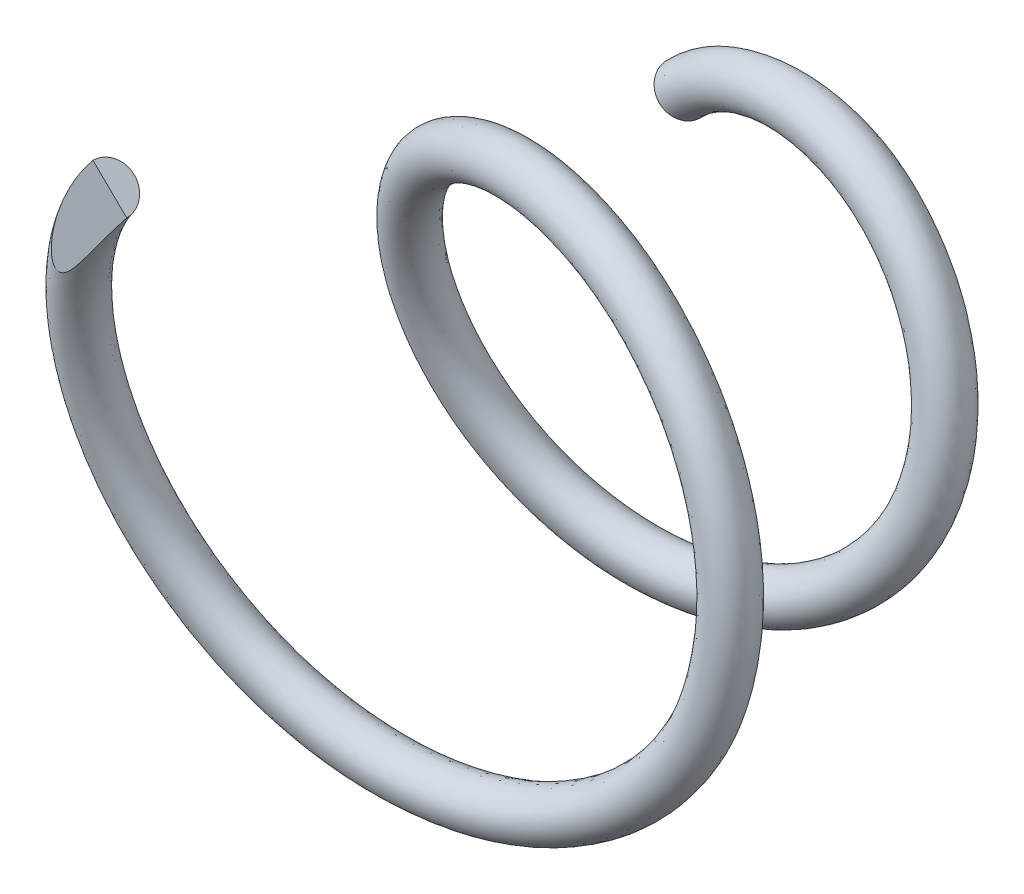
ISO-10303-21;
HEADER;
FILE_DESCRIPTION(('STEP AP214'),'2;1');
FILE_NAME('part.step','',(''),(''),'','','');
FILE_SCHEMA(('AUTOMOTIVE_DESIGN { 1 0 10303 214 1 1 1 1 }'));
ENDSEC;
DATA;
#1=APPLICATION_CONTEXT('core data for automotive mechanical design processes');
#2=APPLICATION_PROTOCOL_DEFINITION('international standard','automotive_design',2000,#1);
#3=PRODUCT_CONTEXT('',#1,'mechanical');
#4=PRODUCT('Part','Part','',(#3));
#5=PRODUCT_RELATED_PRODUCT_CATEGORY('part','',(#4));
#6=PRODUCT_DEFINITION_FORMATION('','',#4);
#7=PRODUCT_DEFINITION_CONTEXT('part definition',#1,'design');
#8=PRODUCT_DEFINITION('design','',#6,#7);
#9=PRODUCT_DEFINITION_SHAPE('','',#8);
#10=(LENGTH_UNIT() NAMED_UNIT(*) SI_UNIT(.MILLI.,.METRE.));
#11=(NAMED_UNIT(*) PLANE_ANGLE_UNIT() SI_UNIT($,.RADIAN.));
#12=(NAMED_UNIT(*) SI_UNIT($,.STERADIAN.) SOLID_ANGLE_UNIT());
#13=UNCERTAINTY_MEASURE_WITH_UNIT(LENGTH_MEASURE(1.E-05),#10,'distance_accuracy_value','');
#14=(GEOMETRIC_REPRESENTATION_CONTEXT(3) GLOBAL_UNCERTAINTY_ASSIGNED_CONTEXT((#13)) GLOBAL_UNIT_ASSIGNED_CONTEXT((#10,
#11,#12)) REPRESENTATION_CONTEXT('',''));
#15=CARTESIAN_POINT('',(0.,0.,0.));
#16=DIRECTION('',(0.,0.,1.));
#17=DIRECTION('',(1.,0.,0.));
#18=AXIS2_PLACEMENT_3D('',#15,#16,#17);
#19=CARTESIAN_POINT('',(0.,0.,0.));
#20=DIRECTION('',(0.,0.,1.));
#21=DIRECTION('',(1.,0.,0.));
#22=AXIS2_PLACEMENT_3D('',#19,#20,#21);
#23=PLANE('',#22);
#24=CARTESIAN_POINT('',(-2.21297652783265,2.20640007679962,0.));
#25=CARTESIAN_POINT('',(-2.17063039745821,2.24980847444052,0.));
#26=CARTESIAN_POINT('',(-2.12715737511697,2.29210529682564,0.));
#27=CARTESIAN_POINT('',(-2.0379233745865,2.37423243078969,0.));
#28=CARTESIAN_POINT('',(-1.99216183188301,2.4140621283195,0.));
#29=CARTESIAN_POINT('',(-1.85149845363001,2.52939391403477,0.));
#30=CARTESIAN_POINT('',(-1.75315204197667,2.60080703140525,0.));
#31=CARTESIAN_POINT('',(-1.58216795734607,2.70916870744265,0.));
#32=CARTESIAN_POINT('',(-1.51177368648665,2.74970806353613,0.));
#33=CARTESIAN_POINT('',(-1.36774901393338,2.82461037677961,0.));
#34=CARTESIAN_POINT('',(-1.29411829186816,2.85897272075531,0.));
#35=CARTESIAN_POINT('',(-1.1441760107579,2.92137860123932,0.));
#36=CARTESIAN_POINT('',(-1.06786259529058,2.94941765842633,0.));
#37=CARTESIAN_POINT('',(-0.913214378527251,2.99927118554379,0.));
#38=CARTESIAN_POINT('',(-0.834879022095876,3.02108392574804,0.));
#39=CARTESIAN_POINT('',(-0.715480042913813,3.04975432908983,0.));
#40=CARTESIAN_POINT('',(-0.674906452030544,3.05871168756732,0.));
#41=CARTESIAN_POINT('',(-0.593441654308402,3.07495482477107,0.));
#42=CARTESIAN_POINT('',(-0.552550585649396,3.08224129272945,0.));
#43=CARTESIAN_POINT('',(-0.429481051752957,3.10152136676237,0.));
#44=CARTESIAN_POINT('',(-0.346882669288809,3.11094139100402,0.));
#45=CARTESIAN_POINT('',(-0.181134854345894,3.12260458079401,0.));
#46=CARTESIAN_POINT('',(-0.0979851248610596,3.12484349858682,0.));
#47=CARTESIAN_POINT('',(0.0682086166954227,3.12197230874858,0.));
#48=CARTESIAN_POINT('',(0.151252600144523,3.11686051537484,0.));
#49=CARTESIAN_POINT('',(0.315934868376835,3.09930981309773,0.));
#50=CARTESIAN_POINT('',(0.397579046439456,3.08692723532893,0.));
#51=CARTESIAN_POINT('',(0.559424485639623,3.0550067894837,0.));
#52=CARTESIAN_POINT('',(0.639625296908396,3.03546672973785,0.));
#53=CARTESIAN_POINT('',(0.876726542178428,2.96625940802458,0.));
#54=CARTESIAN_POINT('',(1.03085575791548,2.9059277725806,0.));
#55=CARTESIAN_POINT('',(1.22459449921634,2.80557895114939,0.));
#56=CARTESIAN_POINT('',(1.2715302242229,2.77917411078108,0.));
#57=CARTESIAN_POINT('',(1.36331488703973,2.72296088790113,0.));
#58=CARTESIAN_POINT('',(1.40816464552076,2.69315386011195,0.));
#59=CARTESIAN_POINT('',(1.49950071710036,2.62691047408991,0.));
#60=CARTESIAN_POINT('',(1.54572860781504,2.5901121198087,0.));
#61=CARTESIAN_POINT('',(1.61191983782701,2.53131863313546,0.));
#62=CARTESIAN_POINT('',(1.63347266387966,2.51110584391939,0.));
#63=CARTESIAN_POINT('',(1.67524421957692,2.46936671219613,0.));
#64=CARTESIAN_POINT('',(1.69546385077008,2.44784127670136,0.));
#65=CARTESIAN_POINT('',(1.73420471449539,2.40322052406922,6.40734352732226E-13));
#66=CARTESIAN_POINT('',(1.75272352153335,2.38012304431604,1.16857233170195E-12));
#67=CARTESIAN_POINT('',(1.77843599548276,2.34402549950886,-5.83569324247808E-13));
#68=CARTESIAN_POINT('',(1.78665811089191,2.33175908041265,-1.59020122933735E-12));
#69=CARTESIAN_POINT('',(1.80214669422299,2.30664246375453,1.58802980442034E-12));
#70=CARTESIAN_POINT('',(1.80941445175371,2.29379308621596,5.76580561724804E-12));
#71=CARTESIAN_POINT('',(1.82039294744281,2.27156078406512,4.14075146093058E-12));
#72=CARTESIAN_POINT('',(1.82449982396362,2.26237512466604,1.08961806649613E-12));
#73=CARTESIAN_POINT('',(1.83165624904138,2.24361730710773,-1.08487259078453E-12));
#74=CARTESIAN_POINT('',(1.83471032454773,2.23404700644698,-2.25278127609903E-13));
#75=CARTESIAN_POINT('',(1.83868696601908,2.21614589511585,2.22746668127619E-13));
#76=CARTESIAN_POINT('',(1.83988225265153,2.20787844616591,0.));
#77=CARTESIAN_POINT('',(1.8400332363456,2.19104787210831,0.));
#78=CARTESIAN_POINT('',(1.83896566035912,2.18248257429525,2.22523763821681E-13));
#79=CARTESIAN_POINT('',(1.83399355854355,2.16969296225049,-1.39045497987244E-13));
#80=CARTESIAN_POINT('',(1.8312969209823,2.16504180594888,-4.53491937799053E-13));
#81=CARTESIAN_POINT('',(1.82444896847528,2.15698716011695,4.53678684499858E-13));
#82=CARTESIAN_POINT('',(1.82029706580869,2.1535841758092,1.67591686608812E-12));
#83=CARTESIAN_POINT('',(1.80933706427969,2.14694693832693,2.24921745763317E-12));
#84=CARTESIAN_POINT('',(1.80214806387559,2.14439214463966,5.90847469132736E-13));
#85=CARTESIAN_POINT('',(1.78781688047365,2.14104819447289,-5.64328992426789E-13));
#86=CARTESIAN_POINT('',(1.78068711125088,2.14018485295668,-1.54922911417924E-13));
#87=CARTESIAN_POINT('',(1.76636026668655,2.13937786966777,1.55447956831877E-13));
#88=CARTESIAN_POINT('',(1.75916304513081,2.13943735474296,0.));
#89=CARTESIAN_POINT('',(1.73762992100258,2.14049387335948,-1.07462634716881E-13));
#90=CARTESIAN_POINT('',(1.72334977976687,2.14236865662059,0.));
#91=CARTESIAN_POINT('',(1.69501552743966,2.14723089012088,0.));
#92=CARTESIAN_POINT('',(1.68096140027547,2.15021826087157,0.));
#93=CARTESIAN_POINT('',(1.6529203284562,2.1568609451493,0.));
#94=CARTESIAN_POINT('',(1.6389343401394,2.16052028395312,0.));
#95=CARTESIAN_POINT('',(1.61108137205787,2.16822792103562,0.));
#96=CARTESIAN_POINT('',(1.5972143316036,2.17227600630483,0.));
#97=CARTESIAN_POINT('',(1.55615173706971,2.18463886314426,0.));
#98=CARTESIAN_POINT('',(1.52905777533626,2.19328803383946,0.));
#99=CARTESIAN_POINT('',(1.47495688710825,2.21085526041667,0.));
#100=CARTESIAN_POINT('',(1.44794997232585,2.21977335093659,0.));
#101=CARTESIAN_POINT('',(1.3668846479539,2.24643821569171,0.));
#102=CARTESIAN_POINT('',(1.3127933053554,2.26409169214101,1.23446398661866E-13));
#103=CARTESIAN_POINT('',(1.20437590568598,2.29774924576749,-1.22853437885858E-13));
#104=CARTESIAN_POINT('',(1.15005222406314,2.3137608383368,-4.68172526998744E-13));
#105=CARTESIAN_POINT('',(1.04079820083945,2.34362927930334,4.6825646490621E-13));
#106=CARTESIAN_POINT('',(0.985867752217686,2.35748574086523,1.75029627130824E-12));
#107=CARTESIAN_POINT('',(0.885494237389761,2.38037634622442,1.47674095054583E-12));
#108=CARTESIAN_POINT('',(0.840146744937013,2.38982911135772,3.95751211502945E-13));
#109=CARTESIAN_POINT('',(0.749107546117266,2.40692424631733,-3.95776590263287E-13));
#110=CARTESIAN_POINT('',(0.703415817862982,2.41456650000763,-1.0622676412377E-13));
#111=CARTESIAN_POINT('',(0.611746607006554,2.42796912227878,1.06247646745433E-13));
#112=CARTESIAN_POINT('',(0.565769069995096,2.43372912061333,0.));
#113=CARTESIAN_POINT('',(0.47361580126318,2.44331051654624,0.));
#114=CARTESIAN_POINT('',(0.427440073211933,2.44713194987945,0.));
#115=CARTESIAN_POINT('',(0.288388837595334,2.45544494472628,0.));
#116=CARTESIAN_POINT('',(0.195295128705563,2.45673862930436,0.));
#117=CARTESIAN_POINT('',(0.00945318639152744,2.45002782704814,0.));
#118=CARTESIAN_POINT('',(-0.0832951634286911,2.44202682461887,0.));
#119=CARTESIAN_POINT('',(-0.218589498876731,2.42329115705025,0.));
#120=CARTESIAN_POINT('',(-0.261674481027592,2.41625636700597,0.));
#121=CARTESIAN_POINT('',(-0.347461334669001,2.40012549051756,0.));
#122=CARTESIAN_POINT('',(-0.390163208795253,2.39102941826596,0.));
#123=CARTESIAN_POINT('',(-0.47509462810511,2.37076665627564,0.));
#124=CARTESIAN_POINT('',(-0.517323893057619,2.35959880059561,0.));
#125=CARTESIAN_POINT('',(-0.601268443229886,2.33547101048696,0.));
#126=CARTESIAN_POINT('',(-0.642983701428732,2.32251098227934,0.));
#127=CARTESIAN_POINT('',(-0.725665195110401,2.29466325303104,0.));
#128=CARTESIAN_POINT('',(-0.766632928864761,2.27978004062443,0.));
#129=CARTESIAN_POINT('',(-0.847753393059117,2.24795649418911,0.));
#130=CARTESIAN_POINT('',(-0.887906178332457,2.23101629910244,0.));
#131=CARTESIAN_POINT('',(-1.00683860797358,2.17703830611585,0.));
#132=CARTESIAN_POINT('',(-1.08421112301584,2.13680384531874,0.));
#133=CARTESIAN_POINT('',(-1.20649658644913,2.06435334765541,0.));
#134=CARTESIAN_POINT('',(-1.25290235258155,2.03461246518319,1.06991213947412E-13));
#135=CARTESIAN_POINT('',(-1.34357342050588,1.97200013080216,-1.07013634590914E-13));
#136=CARTESIAN_POINT('',(-1.38783827171295,1.93912802416999,-3.94104778835996E-13));
#137=CARTESIAN_POINT('',(-1.47414899839117,1.87046321448164,3.9474294122178E-13));
#138=CARTESIAN_POINT('',(-1.51619116467542,1.83466586838067,1.47288967306834E-12));
#139=CARTESIAN_POINT('',(-1.59791919645921,1.76051892832196,-1.47202813084961E-12));
#140=CARTESIAN_POINT('',(-1.63760642585295,1.72217083950692,-5.492109167152E-12));
#141=CARTESIAN_POINT('',(-1.67611076869276,1.68268721972701,-1.52890108284182E-11));
#142=B_SPLINE_CURVE_WITH_KNOTS('',3,(#24,#25,#26,#27,#28,#29,#30,#31,#32,#33,#34,#35,#36,#37,
#38,#39,#40,#41,#42,#43,#44,#45,#46,#47,#48,#49,#50,#51,#52,#53,#54,#55,#56,#57,#58,#59,#60,#61,
#62,#63,#64,#65,#66,#67,#68,#69,#70,#71,#72,#73,#74,#75,#76,#77,#78,#79,#80,#81,#82,#83,#84,#85,
#86,#87,#88,#89,#90,#91,#92,#93,#94,#95,#96,#97,#98,#99,#100,#101,#102,#103,#104,#105,#106,#107,
#108,#109,#110,#111,#112,#113,#114,#115,#116,#117,#118,#119,#120,#121,#122,#123,#124,#125,#126,
#127,#128,#129,#130,#131,#132,#133,#134,#135,#136,#137,#138,#139,#140,#141),.UNSPECIFIED.,.F.,
.F.,(4,2,2,2,2,2,2,2,2,2,2,2,2,2,2,2,2,2,2,2,2,2,2,2,2,2,2,2,2,2,2,2,2,2,2,2,2,2,2,2,2,2,2,2,2,
2,2,2,2,2,2,2,2,2,2,2,2,2,4),(0.,0.181882331721049,0.363809752200621,0.727381560905867,
0.970813825136028,1.2142702408614,1.45789857947876,1.70159453448829,1.826220618355,
1.95079520187794,2.19987175804396,2.44909562039313,2.69837664650524,2.94575136130525,
3.19320188732526,3.68592656724777,3.84738744061494,4.00878424444523,4.18572586168458,
4.27432259282343,4.36285878422195,4.451519335174,4.4957952232837,4.54001065252512,
4.57016353856059,4.60018510354631,4.62514058386799,4.65035397046724,4.6661546094648,
4.68196163704747,4.70445085377293,4.725929449445,4.74748083769534,4.79057535614679,
4.83366679631335,4.87702532596102,4.92036023186949,5.00567485950212,5.09100052332919,
5.26168869347995,5.43155698236301,5.60145572666132,5.74038831363255,5.87932981008207,
6.01829862038915,6.15726486889929,6.43612216573694,6.71487495789355,6.84580049490328,
6.97672513048039,7.10772367150931,7.2387290698933,7.36943405058897,7.50013020752302,
7.76114896947992,7.92638868946675,8.09166303641703,8.25720500730191,8.42265014717527),.UNSPECIFIED.);
#143=CARTESIAN_POINT('',(-2.21297652783265,2.20640007679962,0.));
#144=VERTEX_POINT('',#143);
#145=CARTESIAN_POINT('',(-1.67611076869338,1.68268721972637,0.));
#146=VERTEX_POINT('',#145);
#147=EDGE_CURVE('E12',#144,#146,#142,.T.);
#148=ORIENTED_EDGE('',*,*,#147,.T.);
#149=DIRECTION('',(0.715821012185691,-0.698283809430989,0.));
#150=VECTOR('',#149,1.);
#151=CARTESIAN_POINT('',(-1.94454364826302,1.94454364826299,0.));
#152=LINE('',#151,#150);
#153=EDGE_CURVE('E48',#144,#146,#152,.T.);
#154=ORIENTED_EDGE('',*,*,#153,.F.);
#155=EDGE_LOOP('',(#148,#154));
#156=FACE_BOUND('',#155,.T.);
#157=ADVANCED_FACE('F44',(#156),#23,.F.);
#158=CARTESIAN_POINT('',(0.,0.,7.53));
#159=DIRECTION('',(0.,0.,1.));
#160=DIRECTION('',(1.,0.,0.));
#161=AXIS2_PLACEMENT_3D('',#158,#159,#160);
#162=PLANE('',#161);
#163=DIRECTION('',(0.715821012185671,-0.698283809431009,0.));
#164=VECTOR('',#163,1.);
#165=CARTESIAN_POINT('',(-3.53553390593266,3.53553390593282,7.53));
#166=LINE('',#165,#164);
#167=CARTESIAN_POINT('',(-3.80396678550228,3.79739033446945,7.53));
#168=VERTEX_POINT('',#167);
#169=CARTESIAN_POINT('',(-3.26710102636303,3.27367747739619,7.53));
#170=VERTEX_POINT('',#169);
#171=EDGE_CURVE('E71',#168,#170,#166,.T.);
#172=ORIENTED_EDGE('',*,*,#171,.F.);
#173=CARTESIAN_POINT('',(-3.26710102636303,3.27367747739619,7.53));
#174=CARTESIAN_POINT('',(-3.29198074496813,3.24230618347473,7.53));
#175=CARTESIAN_POINT('',(-3.31672251113313,3.2108256547985,7.53));
#176=CARTESIAN_POINT('',(-3.36594089999186,3.14765708656509,7.53));
#177=CARTESIAN_POINT('',(-3.39041751800389,3.11596904335965,7.53));
#178=CARTESIAN_POINT('',(-3.43911603681347,3.05239680493528,7.53));
#179=CARTESIAN_POINT('',(-3.46333793193645,3.02051260537146,7.53));
#180=CARTESIAN_POINT('',(-3.51161031838058,2.95648678487571,7.53));
#181=CARTESIAN_POINT('',(-3.53566021262212,2.92434471404641,7.53));
#182=CARTESIAN_POINT('',(-3.58355843397354,2.85991269195743,7.53));
#183=CARTESIAN_POINT('',(-3.60740676842194,2.82762274614825,7.53));
#184=CARTESIAN_POINT('',(-3.65494936615575,2.76293487836414,7.53));
#185=CARTESIAN_POINT('',(-3.67864364499299,2.73053696780376,7.53));
#186=CARTESIAN_POINT('',(-3.72594668832305,2.66568663755303,7.53));
#187=CARTESIAN_POINT('',(-3.74955546562723,2.63323422719403,7.53));
#188=CARTESIAN_POINT('',(-3.79679349794791,2.56833929755178,7.53));
#189=CARTESIAN_POINT('',(-3.82042275481259,2.53589677962042,7.53));
#190=CARTESIAN_POINT('',(-3.86785423049546,2.47111714536887,7.53));
#191=CARTESIAN_POINT('',(-3.89165651648678,2.43878007791542,7.53));
#192=CARTESIAN_POINT('',(-3.93960811977559,2.37444365816454,7.53));
#193=CARTESIAN_POINT('',(-3.96375682634308,2.34244385133201,7.53));
#194=CARTESIAN_POINT('',(-4.01277892663771,2.27900842129196,7.53));
#195=CARTESIAN_POINT('',(-4.03765211760425,2.24757264413551,7.52999999999999));
#196=CARTESIAN_POINT('',(-4.07599139419264,2.20125801071409,7.53000000000001));
#197=CARTESIAN_POINT('',(-4.08894525755557,2.18595685094476,7.53000000000002));
#198=CARTESIAN_POINT('',(-4.11533130860293,2.1557720373868,7.52999999999998));
#199=CARTESIAN_POINT('',(-4.12876342272149,2.14088832001033,7.52999999999993));
#200=CARTESIAN_POINT('',(-4.1575099782827,2.11047460895925,7.52999999999993));
#201=CARTESIAN_POINT('',(-4.17288610312551,2.09500276889016,7.52999999999999));
#202=CARTESIAN_POINT('',(-4.20482324953223,2.06532333906206,7.53000000000001));
#203=CARTESIAN_POINT('',(-4.22138215635234,2.05111359002644,7.52999999999999));
#204=CARTESIAN_POINT('',(-4.24609752940524,2.03287544745972,7.52999999999999));
#205=CARTESIAN_POINT('',(-4.25345735725655,2.02778051211281,7.53));
#206=CARTESIAN_POINT('',(-4.26857372207735,2.01822698071776,7.53));
#207=CARTESIAN_POINT('',(-4.27632975504819,2.01376760229631,7.53));
#208=CARTESIAN_POINT('',(-4.29246018699347,2.00571566103168,7.53));
#209=CARTESIAN_POINT('',(-4.30084278189691,2.00213890919957,7.53));
#210=CARTESIAN_POINT('',(-4.31808043264279,1.99650929302221,7.53));
#211=CARTESIAN_POINT('',(-4.32693219695705,1.99444701540097,7.52999999999999));
#212=CARTESIAN_POINT('',(-4.34534508339624,1.99267776752428,7.52999999999999));
#213=CARTESIAN_POINT('',(-4.35492040209386,1.99307176256197,7.53));
#214=CARTESIAN_POINT('',(-4.36873887943884,1.99618271137752,7.53));
#215=CARTESIAN_POINT('',(-4.37327212931813,1.99765121419048,7.53));
#216=CARTESIAN_POINT('',(-4.3820007052081,2.00138276254059,7.53));
#217=CARTESIAN_POINT('',(-4.38619581407085,2.00364631372315,7.53));
#218=CARTESIAN_POINT('',(-4.39929971311846,2.01223394081446,7.53));
#219=CARTESIAN_POINT('',(-4.40725582504056,2.02001402611274,7.53));
#220=CARTESIAN_POINT('',(-4.41948857221064,2.03555052038517,7.53));
#221=CARTESIAN_POINT('',(-4.42417932969076,2.04302001646115,7.53));
#222=CARTESIAN_POINT('',(-4.43245699882579,2.05856510057779,7.53));
#223=CARTESIAN_POINT('',(-4.43604111510118,2.06664216041669,7.53));
#224=CARTESIAN_POINT('',(-4.44331317353407,2.08563241422456,7.53));
#225=CARTESIAN_POINT('',(-4.4466976570128,2.09665753753322,7.53));
#226=CARTESIAN_POINT('',(-4.45241003235369,2.11895656625244,7.53));
#227=CARTESIAN_POINT('',(-4.45473862497006,2.13023030144309,7.53));
#228=CARTESIAN_POINT('',(-4.46055686414566,2.1643657099021,7.53));
#229=CARTESIAN_POINT('',(-4.46284260839124,2.18742717069446,7.52999999999998));
#230=CARTESIAN_POINT('',(-4.46599352392979,2.24526058347933,7.52999999999998));
#231=CARTESIAN_POINT('',(-4.46556424269083,2.28008324031005,7.52999999999999));
#232=CARTESIAN_POINT('',(-4.46168093102165,2.34958662589421,7.53000000000001));
#233=CARTESIAN_POINT('',(-4.45822131315059,2.38426697351583,7.53));
#234=CARTESIAN_POINT('',(-4.44899819127106,2.45336693134897,7.53));
#235=CARTESIAN_POINT('',(-4.44323107641616,2.48778604635275,7.53));
#236=CARTESIAN_POINT('',(-4.42982325338148,2.55622028918028,7.53));
#237=CARTESIAN_POINT('',(-4.42218403743208,2.59023571624917,7.53));
#238=CARTESIAN_POINT('',(-4.39585292436813,2.69573832921831,7.53));
#239=CARTESIAN_POINT('',(-4.37436310101574,2.76653487717933,7.53));
#240=CARTESIAN_POINT('',(-4.32562468384544,2.9061580503758,7.53));
#241=CARTESIAN_POINT('',(-4.29836959786002,2.97498235464849,7.53));
#242=CARTESIAN_POINT('',(-4.23888783075219,3.11036926620676,7.53));
#243=CARTESIAN_POINT('',(-4.20666556656498,3.17693381936753,7.53));
#244=CARTESIAN_POINT('',(-4.13771605959949,3.30769061515577,7.53));
#245=CARTESIAN_POINT('',(-4.10098817185833,3.37188251643175,7.53));
#246=CARTESIAN_POINT('',(-4.02312338748378,3.49808527659596,7.53));
#247=CARTESIAN_POINT('',(-3.98196041191689,3.56008002870616,7.53));
#248=CARTESIAN_POINT('',(-3.89579952400034,3.68101532870551,7.53));
#249=CARTESIAN_POINT('',(-3.85081567122071,3.73996589133278,7.53));
#250=CARTESIAN_POINT('',(-3.80396678550228,3.79739033446945,7.53));
#251=B_SPLINE_CURVE_WITH_KNOTS('',3,(#173,#174,#175,#176,#177,#178,#179,#180,#181,#182,#183,
#184,#185,#186,#187,#188,#189,#190,#191,#192,#193,#194,#195,#196,#197,#198,#199,#200,#201,#202,
#203,#204,#205,#206,#207,#208,#209,#210,#211,#212,#213,#214,#215,#216,#217,#218,#219,#220,#221,
#222,#223,#224,#225,#226,#227,#228,#229,#230,#231,#232,#233,#234,#235,#236,#237,#238,#239,#240,
#241,#242,#243,#244,#245,#246,#247,#248,#249,#250),.UNSPECIFIED.,.F.,.F.,(4,2,2,2,2,2,2,2,2,2,2,
2,2,2,2,2,2,2,2,2,2,2,2,2,2,2,2,2,2,2,2,2,2,2,2,2,2,2,4),(0.,0.12011780552737,0.24023772851369,
0.360360321816855,0.480790244033175,0.601215762503749,0.721628929222923,0.842023237900831,
0.962429865959849,1.0828860417245,1.20315104110303,1.32338269948145,1.38352106132929,
1.44365021215753,1.50906360400582,1.57436283478619,1.60119468370335,1.62799321180236,
1.65524168878171,1.68231933413448,1.71051714615968,1.72473576015177,1.73896343350955,
1.77166576596668,1.79803811339824,1.82447654253502,1.85900041142507,1.89350133449469,
1.96285957636058,2.06713465968258,2.17160241474345,2.27623428772741,2.38078302957199,
2.60239950845644,2.82426688734763,3.04593810248383,3.26764108611848,3.49072731756904,
3.71302555090628),.UNSPECIFIED.);
#252=EDGE_CURVE('E68',#170,#168,#251,.T.);
#253=ORIENTED_EDGE('',*,*,#252,.F.);
#254=EDGE_LOOP('',(#172,#253));
#255=FACE_BOUND('',#254,.T.);
#256=ADVANCED_FACE('F70',(#255),#162,.T.);
#257=CARTESIAN_POINT('',(-3.53553390593266,3.53553390593282,7.53));
#258=DIRECTION('',(0.697117480817518,0.714625391554956,0.0577734167551493));
#259=DIRECTION('',(-0.715821012185671,0.698283809431009,0.));
#260=AXIS2_PLACEMENT_3D('',#257,#258,#259);
#261=PLANE('',#260);
#262=CARTESIAN_POINT('',(-3.53553390593266,3.53553390593282,7.53));
#263=DIRECTION('',(0.697117480817518,0.714625391554956,0.0577734167551493));
#264=DIRECTION('',(-0.715821012185671,0.698283809431009,0.));
#265=AXIS2_PLACEMENT_3D('',#262,#263,#264);
#266=CIRCLE('',#265,0.375);
#267=EDGE_CURVE('E75',#170,#168,#266,.T.);
#268=ORIENTED_EDGE('',*,*,#267,.T.);
#269=ORIENTED_EDGE('',*,*,#171,.T.);
#270=EDGE_LOOP('',(#268,#269));
#271=FACE_BOUND('',#270,.T.);
#272=ADVANCED_FACE('F78',(#271),#261,.T.);
#273=CARTESIAN_POINT('',(-1.94454364826302,1.94454364826299,0.));
#274=DIRECTION('',(0.697117480817498,0.714625391554975,0.0577734167551493));
#275=DIRECTION('',(-0.715821012185691,0.698283809430989,0.));
#276=AXIS2_PLACEMENT_3D('',#273,#274,#275);
#277=PLANE('',#276);
#278=CARTESIAN_POINT('',(-1.94454364826302,1.94454364826299,0.));
#279=DIRECTION('',(0.697117480817498,0.714625391554975,0.0577734167551493));
#280=DIRECTION('',(-0.715821012185691,0.698283809430989,0.));
#281=AXIS2_PLACEMENT_3D('',#278,#279,#280);
#282=CIRCLE('',#281,0.375);
#283=EDGE_CURVE('E81',#144,#146,#282,.T.);
#284=ORIENTED_EDGE('',*,*,#283,.F.);
#285=ORIENTED_EDGE('',*,*,#153,.T.);
#286=EDGE_LOOP('',(#284,#285));
#287=FACE_BOUND('',#286,.T.);
#288=ADVANCED_FACE('F94',(#287),#277,.F.);
#289=CARTESIAN_POINT('',(-2.21297652783265,2.20640007679962,0.));
#290=CARTESIAN_POINT('',(-1.71307085985306,2.71886070852969,0.0364583333333333));
#291=CARTESIAN_POINT('',(-1.18711040624807,2.95001365730171,0.0729166666666653));
#292=CARTESIAN_POINT('',(-0.218880719014028,3.18783482253601,0.145833333333335));
#293=CARTESIAN_POINT('',(0.229868436735477,3.18181180532405,0.182291666666668));
#294=CARTESIAN_POINT('',(1.43112658739061,2.96216337431267,0.291666666666664));
#295=CARTESIAN_POINT('',(2.03783425205308,2.55180036531772,0.364583333333331));
#296=CARTESIAN_POINT('',(2.88213400118499,1.59966475654015,0.510416666666668));
#297=CARTESIAN_POINT('',(3.12335826145538,1.0502282269526,0.583333333333316));
#298=CARTESIAN_POINT('',(3.32596933483803,-0.019338646920697,0.729166666666684));
#299=CARTESIAN_POINT('',(3.28818270859219,-0.541581453219937,0.802083333333347));
#300=CARTESIAN_POINT('',(2.88855021145338,-1.94466697351379,1.02083333333331));
#301=CARTESIAN_POINT('',(2.24816975876411,-2.65064326690971,1.16666666666679));
#302=CARTESIAN_POINT('',(0.789283125070696,-3.4471708494754,1.45833333333321));
#303=CARTESIAN_POINT('',(-0.0294479328472021,-3.54784261008073,1.60416666666668));
#304=CARTESIAN_POINT('',(-1.49844767326601,-3.28332230965561,1.89583333333332));
#305=CARTESIAN_POINT('',(-2.15047016111755,-2.9224615798675,2.04166666666669));
#306=CARTESIAN_POINT('',(-3.1305109558481,-1.95305400418954,2.33333333333332));
#307=CARTESIAN_POINT('',(-3.46036462278417,-1.34642304332961,2.47916666666665));
#308=CARTESIAN_POINT('',(-3.9302143581621,0.540124572699822,2.91666666666669));
#309=CARTESIAN_POINT('',(-3.53993053169851,1.85953011522546,3.20833333333327));
#310=CARTESIAN_POINT('',(-2.40189636316139,3.11267304017418,3.62500000000003));
#311=CARTESIAN_POINT('',(-1.95760978253741,3.44308585290062,3.75000000000004));
#312=CARTESIAN_POINT('',(-0.873199924176696,3.90547316423491,3.99999999999996));
#313=CARTESIAN_POINT('',(-0.228767346261386,4.03699280235785,4.12499999999998));
#314=CARTESIAN_POINT('',(1.2024052687566,3.90348533203092,4.37500000000002));
#315=CARTESIAN_POINT('',(1.99951546650888,3.64546101378266,4.50000000000004));
#316=CARTESIAN_POINT('',(3.10302490705733,2.68287546795429,4.68749999999997));
#317=CARTESIAN_POINT('',(3.45538738152283,2.2656629249465,4.7500000000003));
#318=CARTESIAN_POINT('',(3.86208649223534,1.40904783703998,4.84374999999985));
#319=CARTESIAN_POINT('',(3.97700106872943,1.08479397630773,4.87500000000026));
#320=CARTESIAN_POINT('',(4.11985630613352,0.325131833970226,4.93749999999974));
#321=CARTESIAN_POINT('',(4.14857263652701,-0.10574190046274,4.96875000000024));
#322=CARTESIAN_POINT('',(3.95067478227413,-1.54298163924134,5.05270833333293));
#323=CARTESIAN_POINT('',(3.62586381627306,-2.16329424162839,5.10541666666659));
#324=CARTESIAN_POINT('',(2.8880283357751,-3.15021354938505,5.21083333333341));
#325=CARTESIAN_POINT('',(2.4659757677764,-3.50393407491934,5.26354166666655));
#326=CARTESIAN_POINT('',(1.17846580966174,-4.28915298503509,5.4216666666669));
#327=CARTESIAN_POINT('',(0.293825054650405,-4.44699031474558,5.52708333333374));
#328=CARTESIAN_POINT('',(-1.29574773399336,-4.37122032186203,5.73791666666626));
#329=CARTESIAN_POINT('',(-2.00783225167228,-4.13177641068709,5.84333333333368));
#330=CARTESIAN_POINT('',(-3.20384711065345,-3.43443673186051,6.05416666666631));
#331=CARTESIAN_POINT('',(-3.6894309967579,-2.97518740072047,6.15958333333341));
#332=CARTESIAN_POINT('',(-4.79998507833009,-1.44799754006854,6.47583333333319));
#333=CARTESIAN_POINT('',(-5.07492868466,-0.241637919465409,6.68666666666673));
#334=CARTESIAN_POINT('',(-4.90002112872383,1.97799039986749,7.10833333333327));
#335=CARTESIAN_POINT('',(-4.4558514147712,2.99693527965367,7.31916666666682));
#336=CARTESIAN_POINT('',(-3.80396678550228,3.79739033446945,7.53));
#337=CARTESIAN_POINT('',(-2.24323320898437,2.17538350755529,0.748747290931991));
#338=CARTESIAN_POINT('',(-1.75043264424943,2.69477517265515,0.785205624265324));
#339=CARTESIAN_POINT('',(-1.22763369059292,2.93320851276809,0.821663957598656));
#340=CARTESIAN_POINT('',(-0.262613239823377,3.18436839619224,0.894580624265325));
#341=CARTESIAN_POINT('',(0.186265750696035,3.18449673681202,0.931038957598659));
#342=CARTESIAN_POINT('',(1.39065923831006,2.98122965607749,1.04041395759865));
#343=CARTESIAN_POINT('',(2.00304657185458,2.57901488544658,1.11333062426531));
#344=CARTESIAN_POINT('',(2.8603128978916,1.63806595799985,1.25916395759867));
#345=CARTESIAN_POINT('',(3.10893441627183,1.09171988473651,1.33208062426529));
#346=CARTESIAN_POINT('',(3.32577617869845,0.0245881977426949,1.47791395759869));
#347=CARTESIAN_POINT('',(3.29485404157336,-0.498298583639013,1.55083062426532));
#348=CARTESIAN_POINT('',(2.91345029293932,-1.9069952740122,1.76958062426532));
#349=CARTESIAN_POINT('',(2.28192462933716,-2.62149360395504,1.91541395759876));
#350=CARTESIAN_POINT('',(0.832666496183987,-3.43682786808255,2.20708062426522));
#351=CARTESIAN_POINT('',(0.0148544441561457,-3.54780160170649,2.35291395759859));
#352=CARTESIAN_POINT('',(-1.45797523365213,-3.30134129776993,2.64458062426539));
#353=CARTESIAN_POINT('',(-2.11468950955042,-2.94827147443697,2.79041395759868));
#354=CARTESIAN_POINT('',(-3.10680321492128,-1.99026084110072,3.08208062426531));
#355=CARTESIAN_POINT('',(-3.44401634856047,-1.38726512779639,3.22791395759864));
#356=CARTESIAN_POINT('',(-3.93619632418081,0.494593255218777,3.66541395759869));
#357=CARTESIAN_POINT('',(-3.5607134896039,1.81927192345444,3.95708062426526));
#358=CARTESIAN_POINT('',(-2.43621321141868,3.08561716629844,4.37374729093202));
#359=CARTESIAN_POINT('',(-1.99546834676973,3.42103496021455,4.49874729093203));
#360=CARTESIAN_POINT('',(-0.915854217711701,3.89546696687589,4.74874729093195));
#361=CARTESIAN_POINT('',(-0.272692074777998,4.03404856692163,4.87374729093197));
#362=CARTESIAN_POINT('',(1.16020098436805,3.91600925556242,5.12374729093201));
#363=CARTESIAN_POINT('',(1.96022984098413,3.66649663296576,5.24874729093203));
#364=CARTESIAN_POINT('',(3.07412171957735,2.71557395256968,5.43624729093197));
#365=CARTESIAN_POINT('',(3.43094932159531,2.30206394581216,5.49874729093229));
#366=CARTESIAN_POINT('',(3.84673619788087,1.44970558500091,5.59249729093184));
#367=CARTESIAN_POINT('',(3.96508090490855,1.12665097191475,5.62374729093225));
#368=CARTESIAN_POINT('',(4.11594867635943,0.368477292775827,5.68624729093173));
#369=CARTESIAN_POINT('',(4.1492078098284,-0.06204690089668,5.71749729093223));
#370=CARTESIAN_POINT('',(3.96638729776207,-1.50148335768386,5.80145562426492));
#371=CARTESIAN_POINT('',(3.64790934932928,-2.12545568991821,5.85416395759858));
#372=CARTESIAN_POINT('',(2.91999822067743,-3.120285502311,5.9595806242654));
#373=CARTESIAN_POINT('',(2.50138479270891,-3.47844864136963,6.01228895759854));
#374=CARTESIAN_POINT('',(1.22127732897967,-4.2769908979399,6.17041395759889));
#375=CARTESIAN_POINT('',(0.337718558844478,-4.44368065323551,6.27583062426574));
#376=CARTESIAN_POINT('',(-1.25342960244952,-4.38333516090658,6.48666395759825));
#377=CARTESIAN_POINT('',(-1.96823887368213,-4.15054458576431,6.59208062426567));
#378=CARTESIAN_POINT('',(-3.17151735449606,-3.46401149900254,6.8029139575983));
#379=CARTESIAN_POINT('',(-3.66165729851125,-3.00893429450749,6.9083306242654));
#380=CARTESIAN_POINT('',(-4.78677874445497,-1.49082316809517,7.22458062426518));
#381=CARTESIAN_POINT('',(-5.07250548837665,-0.285927905390496,7.43541395759872));
#382=CARTESIAN_POINT('',(-4.91632460260492,1.9367390789179,7.85708062426526));
#383=CARTESIAN_POINT('',(-4.48018197071424,2.96013777177824,8.06791395759881));
#384=CARTESIAN_POINT('',(-3.83422346665401,3.76637376522512,8.27874729093199));
#385=CARTESIAN_POINT('',(-1.7063674498451,1.65167065048205,0.748747290931991));
#386=CARTESIAN_POINT('',(-1.33353613323719,2.04808009220004,0.785205624265324));
#387=CARTESIAN_POINT('',(-0.936753464400245,2.23179103357333,0.821663957598656));
#388=CARTESIAN_POINT('',(-0.202612870476683,2.42740224695656,0.894580624265325));
#389=CARTESIAN_POINT('',(0.139792274851749,2.4297778974502,0.931038957598659));
#390=CARTESIAN_POINT('',(1.06064099054868,2.2807803603035,1.04041395759865));
#391=CARTESIAN_POINT('',(1.53199047620546,1.97687497140922,1.11333062426531));
#392=CARTESIAN_POINT('',(2.19562654876471,1.26036450776735,1.25916395759867));
#393=CARTESIAN_POINT('',(2.39075536240518,0.842057566085323,1.33208062426529));
#394=CARTESIAN_POINT('',(2.56544647810955,0.0212448583577503,1.47791395759869));
#395=CARTESIAN_POINT('',(2.5456709049007,-0.382824489222664,1.55083062426532));
#396=CARTESIAN_POINT('',(2.26139089231124,-1.47599979400586,1.76958062426532));
#397=CARTESIAN_POINT('',(1.77737314888405,-2.03723059046376,1.91541395759876));
#398=CARTESIAN_POINT('',(0.653639843896729,-2.68590515050897,2.20708062426522));
#399=CARTESIAN_POINT('',(0.0141446302542626,-2.78097181230554,2.35291395759859));
#400=CARTESIAN_POINT('',(-1.14608459040297,-2.6008038899613,2.64458062426539));
#401=CARTESIAN_POINT('',(-1.66794607599182,-2.32894422019525,2.79041395759868));
#402=CARTESIAN_POINT('',(-2.46279012030492,-1.57990358237563,3.08208062426531));
#403=CARTESIAN_POINT('',(-2.73708075844535,-1.10429286924047,3.22791395759864));
#404=CARTESIAN_POINT('',(-3.14809480555267,0.391051412712415,3.66541395759869));
#405=CARTESIAN_POINT('',(-2.86388449744616,1.45953973047442,3.95708062426526));
#406=CARTESIAN_POINT('',(-1.96790312357306,2.49162688175667,4.37374729093202));
#407=CARTESIAN_POINT('',(-1.6137894722185,2.76574111819103,4.49874729093203));
#408=CARTESIAN_POINT('',(-0.742656959855108,3.15716385221353,4.74874729093195));
#409=CARTESIAN_POINT('',(-0.22173030721148,3.27375549471553,4.87374729093197));
#410=CARTESIAN_POINT('',(0.943424407269307,3.18549534866633,5.12374729093201));
#411=CARTESIAN_POINT('',(1.59612433425325,2.98650178877593,5.24874729093203));
#412=CARTESIAN_POINT('',(2.50814368933698,2.21528871580624,5.43624729093197));
#413=CARTESIAN_POINT('',(2.80088409592259,1.87906559639826,5.49874729093229));
#414=CARTESIAN_POINT('',(3.14299128812043,1.1840073587808,5.59249729093184));
#415=CARTESIAN_POINT('',(3.24057821910751,0.920324870908785,5.62374729093225));
#416=CARTESIAN_POINT('',(3.3656821828731,0.300840133792353,5.68624729093173));
#417=CARTESIAN_POINT('',(3.39289111574624,-0.0510526869988018,5.71749729093223));
#418=CARTESIAN_POINT('',(3.24809359300659,-1.22951544630888,5.80145562426492));
#419=CARTESIAN_POINT('',(2.99296190402777,-1.74386958519369,5.85416395759858));
#420=CARTESIAN_POINT('',(2.40197369045217,-2.56691880361238,5.9595806242654));
#421=CARTESIAN_POINT('',(2.06025745454698,-2.86555387209272,6.01228895759854));
#422=CARTESIAN_POINT('',(1.01076377831459,-3.5359663623923,6.17041395759889));
#423=CARTESIAN_POINT('',(0.280431631810748,-3.68392804279002,6.27583062426574));
#424=CARTESIAN_POINT('',(-1.04373386823388,-3.65085067373876,6.48666395759825));
#425=CARTESIAN_POINT('',(-1.6433805542102,-3.46522285452948,6.59208062426567));
#426=CARTESIAN_POINT('',(-2.65960774618328,-2.90441578918721,6.8029139575983));
#427=CARTESIAN_POINT('',(-3.07753235519852,-2.52819938550145,6.9083306242654));
#428=CARTESIAN_POINT('',(-4.04551000128897,-1.26223475119633,7.22458062426518));
#429=CARTESIAN_POINT('',(-4.30589017613469,-0.243984803883197,7.43541395759872));
#430=CARTESIAN_POINT('',(-4.20230553870778,1.65454226943676,7.85708062426526));
#431=CARTESIAN_POINT('',(-3.84325395188275,2.53900020869792,8.06791395759881));
#432=CARTESIAN_POINT('',(-3.29735770751475,3.24266090815187,8.27874729093199));
#433=CARTESIAN_POINT('',(-1.67611076869338,1.68268721972637,0.));
#434=CARTESIAN_POINT('',(-1.29617434884042,2.07216562807462,0.0364583333333333));
#435=CARTESIAN_POINT('',(-0.896230180055402,2.24859617810701,0.0729166666666653));
#436=CARTESIAN_POINT('',(-0.158880349667327,2.43086867330027,0.145833333333335));
#437=CARTESIAN_POINT('',(0.183394960891151,2.42709296596219,0.182291666666668));
#438=CARTESIAN_POINT('',(1.1011083396293,2.26171407853878,0.291666666666664));
#439=CARTESIAN_POINT('',(1.56677815640406,1.94966045128029,0.364583333333332));
#440=CARTESIAN_POINT('',(2.217447652058,1.22196330630772,0.510416666666668));
#441=CARTESIAN_POINT('',(2.40517920758873,0.800565908301486,0.583333333333316));
#442=CARTESIAN_POINT('',(2.56563963424913,-0.0226819863057101,0.729166666666684));
#443=CARTESIAN_POINT('',(2.53899957191954,-0.426107358803615,0.802083333333347));
#444=CARTESIAN_POINT('',(2.23649081082529,-1.51367149350739,1.02083333333331));
#445=CARTESIAN_POINT('',(1.74361827831095,-2.06638025341843,1.16666666666679));
#446=CARTESIAN_POINT('',(0.610256472783485,-2.69624813190183,1.45833333333321));
#447=CARTESIAN_POINT('',(-0.0301577467490432,-2.78101282067977,1.60416666666668));
#448=CARTESIAN_POINT('',(-1.18655703001689,-2.58278490184697,1.89583333333332));
#449=CARTESIAN_POINT('',(-1.70372672755895,-2.30313432562559,2.04166666666669));
#450=CARTESIAN_POINT('',(-2.48649786123174,-1.54269674546464,2.33333333333332));
#451=CARTESIAN_POINT('',(-2.75342903266897,-1.06345078477367,2.47916666666665));
#452=CARTESIAN_POINT('',(-3.14211283953411,0.436582730193423,2.9166666666667));
#453=CARTESIAN_POINT('',(-2.84310153954077,1.49979792224544,3.20833333333327));
#454=CARTESIAN_POINT('',(-1.93358627531576,2.5186827556324,3.62500000000003));
#455=CARTESIAN_POINT('',(-1.57593090798615,2.78779201087723,3.75000000000004));
#456=CARTESIAN_POINT('',(-0.700002666320137,3.16717004957242,3.99999999999996));
#457=CARTESIAN_POINT('',(-0.177805578694868,3.27669973015175,4.12499999999998));
#458=CARTESIAN_POINT('',(0.985628691657851,3.17297142513483,4.37500000000002));
#459=CARTESIAN_POINT('',(1.635409959778,2.96546616959272,4.50000000000004));
#460=CARTESIAN_POINT('',(2.53704687681695,2.1825902311909,4.68749999999997));
#461=CARTESIAN_POINT('',(2.82532215585012,1.84266457553259,4.7500000000003));
#462=CARTESIAN_POINT('',(3.1583415824749,1.14334961081987,4.84374999999985));
#463=CARTESIAN_POINT('',(3.25249838292834,0.878467875301809,4.87500000000026));
#464=CARTESIAN_POINT('',(3.36958981264724,0.25749467498671,4.93749999999974));
#465=CARTESIAN_POINT('',(3.39225594244485,-0.0947476865648614,4.96875000000024));
#466=CARTESIAN_POINT('',(3.23238107751865,-1.27101372786636,5.05270833333293));
#467=CARTESIAN_POINT('',(2.97091637097154,-1.78170813690379,5.10541666666659));
#468=CARTESIAN_POINT('',(2.37000380554984,-2.59684685068649,5.21083333333341));
#469=CARTESIAN_POINT('',(2.02484842961452,-2.89103930564243,5.26354166666655));
#470=CARTESIAN_POINT('',(0.967952258996549,-3.54812844948749,5.4216666666669));
#471=CARTESIAN_POINT('',(0.236538127616719,-3.68723770430018,5.52708333333374));
#472=CARTESIAN_POINT('',(-1.08605199977776,-3.63873583469412,5.73791666666626));
#473=CARTESIAN_POINT('',(-1.68297393220011,-3.44645467945219,5.84333333333368));
#474=CARTESIAN_POINT('',(-2.6919375023409,-2.87484102204526,6.05416666666631));
#475=CARTESIAN_POINT('',(-3.1053060534453,-2.49445249171429,6.15958333333341));
#476=CARTESIAN_POINT('',(-4.05871633516381,-1.21940912316998,6.47583333333319));
#477=CARTESIAN_POINT('',(-4.30831337241829,-0.199694817958172,6.68666666666673));
#478=CARTESIAN_POINT('',(-4.18600206482644,1.69579359038642,7.10833333333327));
#479=CARTESIAN_POINT('',(-3.81892339593971,2.57579771657335,7.31916666666682));
#480=CARTESIAN_POINT('',(-3.26710102636303,3.27367747739619,7.53));
#481=CARTESIAN_POINT('',(-1.64585408754166,1.7137037889707,-0.748747290931991));
#482=CARTESIAN_POINT('',(-1.25881256444365,2.09625116394921,-0.712288957598657));
#483=CARTESIAN_POINT('',(-0.855706895710559,2.26540132264068,-0.675830624265325));
#484=CARTESIAN_POINT('',(-0.115147828857972,2.43433509964399,-0.602913957598656));
#485=CARTESIAN_POINT('',(0.226997646930553,2.42440803447418,-0.566455624265322));
#486=CARTESIAN_POINT('',(1.14157568870992,2.24264779677405,-0.457080624265327));
#487=CARTESIAN_POINT('',(1.60156583660267,1.92244593115136,-0.38416395759865));
#488=CARTESIAN_POINT('',(2.23926875535129,1.1835621048481,-0.238330624265331));
#489=CARTESIAN_POINT('',(2.41960305277229,0.759074250517649,-0.165413957598659));
#490=CARTESIAN_POINT('',(2.56583279038871,-0.0666088309691702,-0.0195806242653222));
#491=CARTESIAN_POINT('',(2.53232823893838,-0.469390228384566,0.0533360424013697));
#492=CARTESIAN_POINT('',(2.21159072933935,-1.55134319300893,0.272086042401289));
#493=CARTESIAN_POINT('',(1.70986340773786,-2.09552991637309,0.417919375734824));
#494=CARTESIAN_POINT('',(0.566873101670241,-2.70659111329468,0.709586042401194));
#495=CARTESIAN_POINT('',(-0.0744601237523484,-2.781053829054,0.855419375734777));
#496=CARTESIAN_POINT('',(-1.22702946963081,-2.56476591373265,1.14708604240124));
#497=CARTESIAN_POINT('',(-1.73950737912608,-2.27732443105593,1.29291937573469));
#498=CARTESIAN_POINT('',(-2.51020560215856,-1.50548990855364,1.58458604240133));
#499=CARTESIAN_POINT('',(-2.76977730689259,-1.02260870030687,1.73041937573466));
#500=CARTESIAN_POINT('',(-3.13613087351554,0.482114047674431,2.1679193757347));
#501=CARTESIAN_POINT('',(-2.82231858163538,1.54005611401646,2.45958604240128));
#502=CARTESIAN_POINT('',(-1.89926942705847,2.54573862950814,2.87625270906804));
#503=CARTESIAN_POINT('',(-1.53807234375381,2.80984290356343,3.00125270906805));
#504=CARTESIAN_POINT('',(-0.657348372785165,3.1771762469313,3.25125270906797));
#505=CARTESIAN_POINT('',(-0.133880850178257,3.27964396558797,3.37625270906799));
#506=CARTESIAN_POINT('',(1.0278329760464,3.16044750160333,3.62625270906803));
#507=CARTESIAN_POINT('',(1.67469558530274,2.94443055040951,3.75125270906805));
#508=CARTESIAN_POINT('',(2.56595006429693,2.14989174657557,3.93875270906798));
#509=CARTESIAN_POINT('',(2.84976021577764,1.80626355466693,4.00125270906831));
#510=CARTESIAN_POINT('',(3.17369187682937,1.10269186285894,4.09500270906786));
#511=CARTESIAN_POINT('',(3.26441854674918,0.836610879694832,4.12625270906827));
#512=CARTESIAN_POINT('',(3.37349744242137,0.214149216181067,4.18875270906775));
#513=CARTESIAN_POINT('',(3.39162076914346,-0.138442686130921,4.22000270906825));
#514=CARTESIAN_POINT('',(3.21666856203071,-1.31251200942384,4.30396104240094));
#515=CARTESIAN_POINT('',(2.94887083791532,-1.8195466886139,4.3566693757346));
#516=CARTESIAN_POINT('',(2.3380339206475,-2.6267748977606,4.46208604240142));
#517=CARTESIAN_POINT('',(1.98943940468207,-2.91652473919215,4.51479437573456));
#518=CARTESIAN_POINT('',(0.925140739678506,-3.56029053658268,4.6729193757349));
#519=CARTESIAN_POINT('',(0.192644623422689,-3.69054736581034,4.77833604240175));
#520=CARTESIAN_POINT('',(-1.12837013132163,-3.62662099564948,4.98916937573427));
#521=CARTESIAN_POINT('',(-1.72256731019003,-3.42768650437489,5.09458604240169));
#522=CARTESIAN_POINT('',(-2.72426725849853,-2.84526625490331,5.30541937573432));
#523=CARTESIAN_POINT('',(-3.13307975169208,-2.46070559792713,5.41083604240142));
#524=CARTESIAN_POINT('',(-4.07192266903866,-1.17658349514364,5.7270860424012));
#525=CARTESIAN_POINT('',(-4.31073656870188,-0.155404832033148,5.93791937573474));
#526=CARTESIAN_POINT('',(-4.16969859094511,1.73704491133608,6.35958604240128));
#527=CARTESIAN_POINT('',(-3.79459283999666,2.61259522444878,6.57041937573483));
#528=CARTESIAN_POINT('',(-3.23684434521131,3.30469404664051,6.78125270906801));
#529=CARTESIAN_POINT('',(-2.18271984668093,2.23741664604394,-0.748747290931991));
#530=CARTESIAN_POINT('',(-1.67570907545669,2.74294624440424,-0.712288957598657));
#531=CARTESIAN_POINT('',(-1.14658712190322,2.96681880183533,-0.675830624265325));
#532=CARTESIAN_POINT('',(-0.175148198204679,3.19130124887979,-0.602913957598656));
#533=CARTESIAN_POINT('',(0.27347112277492,3.17912687383608,-0.566455624265322));
#534=CARTESIAN_POINT('',(1.47159393647115,2.94309709254786,-0.457080624265327));
#535=CARTESIAN_POINT('',(2.07262193225158,2.52458584518886,-0.38416395759865));
#536=CARTESIAN_POINT('',(2.90395510447839,1.56126355508045,-0.238330624265331));
#537=CARTESIAN_POINT('',(3.13778210663894,1.0087365691687,-0.165413957598659));
#538=CARTESIAN_POINT('',(3.32616249097761,-0.0632654915840887,-0.0195806242653223));
#539=CARTESIAN_POINT('',(3.28151137561103,-0.58486432280086,0.0533360424013697));
#540=CARTESIAN_POINT('',(2.86365012996744,-1.98233867301538,0.272086042401289));
#541=CARTESIAN_POINT('',(2.21441488819107,-2.67979292986437,0.417919375734824));
#542=CARTESIAN_POINT('',(0.745899753957405,-3.45751383086825,0.709586042401194));
#543=CARTESIAN_POINT('',(-0.0737503098505498,-3.54788361845496,0.855419375734777));
#544=CARTESIAN_POINT('',(-1.53892011287989,-3.26530332154128,1.14708604240124));
#545=CARTESIAN_POINT('',(-2.18625081268469,-2.89665168529804,1.29291937573469));
#546=CARTESIAN_POINT('',(-3.15421869677492,-1.91584716727835,1.58458604240133));
#547=CARTESIAN_POINT('',(-3.47671289700786,-1.30558095886282,1.73041937573466));
#548=CARTESIAN_POINT('',(-3.92423239214339,0.585655890180867,2.1679193757347));
#549=CARTESIAN_POINT('',(-3.51914757379312,1.89978830699649,2.45958604240128));
#550=CARTESIAN_POINT('',(-2.36757951490409,3.13972891404991,2.87625270906804));
#551=CARTESIAN_POINT('',(-1.91975121830509,3.46513674558669,3.00125270906805));
#552=CARTESIAN_POINT('',(-0.830545630641691,3.91547936159392,3.25125270906797));
#553=CARTESIAN_POINT('',(-0.184842617744775,4.03993703779406,3.37625270906799));
#554=CARTESIAN_POINT('',(1.24460955314514,3.89096140849943,3.62625270906803));
#555=CARTESIAN_POINT('',(2.03880109203363,3.62442539459956,3.75125270906805));
#556=CARTESIAN_POINT('',(3.1319280945373,2.6501769833389,3.93875270906798));
#557=CARTESIAN_POINT('',(3.47982544145036,2.22926190408083,4.00125270906831));
#558=CARTESIAN_POINT('',(3.87743678658981,1.36839008907905,4.09500270906786));
#559=CARTESIAN_POINT('',(3.98892123255031,1.04293698070071,4.12625270906827));
#560=CARTESIAN_POINT('',(4.12376393590761,0.281786375164626,4.18875270906775));
#561=CARTESIAN_POINT('',(4.14793746322562,-0.1494369000288,4.22000270906825));
#562=CARTESIAN_POINT('',(3.93496226678619,-1.58447992079882,4.30396104240094));
#563=CARTESIAN_POINT('',(3.60381828321683,-2.20113279333857,4.3566693757346));
#564=CARTESIAN_POINT('',(2.85605845087276,-3.18014159645909,4.46208604240142));
#565=CARTESIAN_POINT('',(2.43056674284389,-3.52941950846906,4.51479437573456));
#566=CARTESIAN_POINT('',(1.13565429034381,-4.30131507213028,4.6729193757349));
#567=CARTESIAN_POINT('',(0.249931550456331,-4.45029997625565,4.77833604240175));
#568=CARTESIAN_POINT('',(-1.33806586553719,-4.35910548281748,4.98916937573427));
#569=CARTESIAN_POINT('',(-2.04742562966243,-4.11300823560987,5.09458604240169));
#570=CARTESIAN_POINT('',(-3.23617686681085,-3.40486196471848,5.30541937573432));
#571=CARTESIAN_POINT('',(-3.71720469500454,-2.94144050693345,5.41083604240142));
#572=CARTESIAN_POINT('',(-4.81319141220522,-1.40517191204192,5.7270860424012));
#573=CARTESIAN_POINT('',(-5.07735188094335,-0.197347933540321,5.93791937573474));
#574=CARTESIAN_POINT('',(-4.88371765484274,2.01924172081709,6.35958604240128));
#575=CARTESIAN_POINT('',(-4.43152085882815,3.0337327875291,6.57041937573483));
#576=CARTESIAN_POINT('',(-3.77371010435056,3.82840690371377,6.78125270906801));
#577=CARTESIAN_POINT('',(-2.21297652783265,2.20640007679962,0.));
#578=CARTESIAN_POINT('',(-1.71307085985306,2.71886070852969,0.0364583333333333));
#579=CARTESIAN_POINT('',(-1.18711040624807,2.95001365730171,0.0729166666666653));
#580=CARTESIAN_POINT('',(-0.218880719014028,3.18783482253601,0.145833333333335));
#581=CARTESIAN_POINT('',(0.229868436735477,3.18181180532405,0.182291666666668));
#582=CARTESIAN_POINT('',(1.43112658739061,2.96216337431267,0.291666666666664));
#583=CARTESIAN_POINT('',(2.03783425205308,2.55180036531772,0.364583333333331));
#584=CARTESIAN_POINT('',(2.88213400118499,1.59966475654015,0.510416666666668));
#585=CARTESIAN_POINT('',(3.12335826145538,1.0502282269526,0.583333333333316));
#586=CARTESIAN_POINT('',(3.32596933483803,-0.019338646920697,0.729166666666684));
#587=CARTESIAN_POINT('',(3.28818270859219,-0.541581453219937,0.802083333333347));
#588=CARTESIAN_POINT('',(2.88855021145338,-1.94466697351379,1.02083333333331));
#589=CARTESIAN_POINT('',(2.24816975876411,-2.65064326690971,1.16666666666679));
#590=CARTESIAN_POINT('',(0.789283125070696,-3.4471708494754,1.45833333333321));
#591=CARTESIAN_POINT('',(-0.0294479328472021,-3.54784261008073,1.60416666666668));
#592=CARTESIAN_POINT('',(-1.49844767326601,-3.28332230965561,1.89583333333332));
#593=CARTESIAN_POINT('',(-2.15047016111755,-2.9224615798675,2.04166666666669));
#594=CARTESIAN_POINT('',(-3.1305109558481,-1.95305400418954,2.33333333333332));
#595=CARTESIAN_POINT('',(-3.46036462278417,-1.34642304332961,2.47916666666665));
#596=CARTESIAN_POINT('',(-3.9302143581621,0.540124572699822,2.91666666666669));
#597=CARTESIAN_POINT('',(-3.53993053169851,1.85953011522546,3.20833333333327));
#598=CARTESIAN_POINT('',(-2.40189636316139,3.11267304017418,3.62500000000003));
#599=CARTESIAN_POINT('',(-1.95760978253741,3.44308585290062,3.75000000000004));
#600=CARTESIAN_POINT('',(-0.873199924176696,3.90547316423491,3.99999999999996));
#601=CARTESIAN_POINT('',(-0.228767346261386,4.03699280235785,4.12499999999998));
#602=CARTESIAN_POINT('',(1.2024052687566,3.90348533203092,4.37500000000002));
#603=CARTESIAN_POINT('',(1.99951546650888,3.64546101378266,4.50000000000004));
#604=CARTESIAN_POINT('',(3.10302490705733,2.68287546795429,4.68749999999997));
#605=CARTESIAN_POINT('',(3.45538738152283,2.2656629249465,4.7500000000003));
#606=CARTESIAN_POINT('',(3.86208649223534,1.40904783703998,4.84374999999985));
#607=CARTESIAN_POINT('',(3.97700106872943,1.08479397630773,4.87500000000026));
#608=CARTESIAN_POINT('',(4.11985630613352,0.325131833970226,4.93749999999974));
#609=CARTESIAN_POINT('',(4.14857263652701,-0.10574190046274,4.96875000000024));
#610=CARTESIAN_POINT('',(3.95067478227413,-1.54298163924134,5.05270833333293));
#611=CARTESIAN_POINT('',(3.62586381627306,-2.16329424162839,5.10541666666659));
#612=CARTESIAN_POINT('',(2.8880283357751,-3.15021354938505,5.21083333333341));
#613=CARTESIAN_POINT('',(2.4659757677764,-3.50393407491934,5.26354166666655));
#614=CARTESIAN_POINT('',(1.17846580966174,-4.28915298503509,5.4216666666669));
#615=CARTESIAN_POINT('',(0.293825054650405,-4.44699031474558,5.52708333333374));
#616=CARTESIAN_POINT('',(-1.29574773399336,-4.37122032186203,5.73791666666626));
#617=CARTESIAN_POINT('',(-2.00783225167228,-4.13177641068709,5.84333333333368));
#618=CARTESIAN_POINT('',(-3.20384711065345,-3.43443673186051,6.05416666666631));
#619=CARTESIAN_POINT('',(-3.6894309967579,-2.97518740072047,6.15958333333341));
#620=CARTESIAN_POINT('',(-4.79998507833009,-1.44799754006854,6.47583333333319));
#621=CARTESIAN_POINT('',(-5.07492868466,-0.241637919465409,6.68666666666673));
#622=CARTESIAN_POINT('',(-4.90002112872383,1.97799039986749,7.10833333333327));
#623=CARTESIAN_POINT('',(-4.4558514147712,2.99693527965367,7.31916666666682));
#624=CARTESIAN_POINT('',(-3.80396678550228,3.79739033446945,7.53));
#625=(BOUNDED_SURFACE() B_SPLINE_SURFACE(3,3,((#289,#290,#291,#292,#293,#294,#295,#296,#297,
#298,#299,#300,#301,#302,#303,#304,#305,#306,#307,#308,#309,#310,#311,#312,#313,#314,#315,#316,
#317,#318,#319,#320,#321,#322,#323,#324,#325,#326,#327,#328,#329,#330,#331,#332,#333,#334,#335,
#336),(#337,#338,#339,#340,#341,#342,#343,#344,#345,#346,#347,#348,#349,#350,#351,#352,#353,
#354,#355,#356,#357,#358,#359,#360,#361,#362,#363,#364,#365,#366,#367,#368,#369,#370,#371,#372,
#373,#374,#375,#376,#377,#378,#379,#380,#381,#382,#383,#384),(#385,#386,#387,#388,#389,#390,
#391,#392,#393,#394,#395,#396,#397,#398,#399,#400,#401,#402,#403,#404,#405,#406,#407,#408,#409,
#410,#411,#412,#413,#414,#415,#416,#417,#418,#419,#420,#421,#422,#423,#424,#425,#426,#427,#428,
#429,#430,#431,#432),(#433,#434,#435,#436,#437,#438,#439,#440,#441,#442,#443,#444,#445,#446,
#447,#448,#449,#450,#451,#452,#453,#454,#455,#456,#457,#458,#459,#460,#461,#462,#463,#464,#465,
#466,#467,#468,#469,#470,#471,#472,#473,#474,#475,#476,#477,#478,#479,#480),(#481,#482,#483,
#484,#485,#486,#487,#488,#489,#490,#491,#492,#493,#494,#495,#496,#497,#498,#499,#500,#501,#502,
#503,#504,#505,#506,#507,#508,#509,#510,#511,#512,#513,#514,#515,#516,#517,#518,#519,#520,#521,
#522,#523,#524,#525,#526,#527,#528),(#529,#530,#531,#532,#533,#534,#535,#536,#537,#538,#539,
#540,#541,#542,#543,#544,#545,#546,#547,#548,#549,#550,#551,#552,#553,#554,#555,#556,#557,#558,
#559,#560,#561,#562,#563,#564,#565,#566,#567,#568,#569,#570,#571,#572,#573,#574,#575,#576),
(#577,#578,#579,#580,#581,#582,#583,#584,#585,#586,#587,#588,#589,#590,#591,#592,#593,#594,#595,
#596,#597,#598,#599,#600,#601,#602,#603,#604,#605,#606,#607,#608,#609,#610,#611,#612,#613,#614,
#615,#616,#617,#618,#619,#620,#621,#622,#623,#624)),.UNSPECIFIED.,.T.,.F.,
.F.) B_SPLINE_SURFACE_WITH_KNOTS((4,3,4),(4,2,2,2,2,2,2,2,2,2,2,2,2,2,2,2,2,2,2,2,2,2,2,4),(0.,
0.5,1.),(0.,0.0145252324037185,0.0290504648074369,0.0581009296148738,0.0871513944223107,
0.116201859229748,0.174302788844621,0.232403718459495,0.290504648074369,0.348605577689243,
0.464807436918991,0.51460823373174,0.564409030544489,0.614209827357238,0.639110225763612,
0.651560424966799,0.664010624169987,0.685009960159362,0.706009296148738,0.74800796812749,
0.790006640106242,0.832005312084993,0.916002656042497,1.),
.UNSPECIFIED.) GEOMETRIC_REPRESENTATION_ITEM() RATIONAL_B_SPLINE_SURFACE(((1.,1.,1.,1.,1.,1.,1.,
1.,1.,1.,1.,1.,1.,1.,1.,1.,1.,1.,1.,1.,1.,1.,1.,1.,1.,1.,1.,1.,1.,1.,1.,1.,1.,1.,1.,1.,1.,1.,1.,
1.,1.,1.,1.,1.,1.,1.,1.,1.),(0.333333333333333,0.333333333333333,0.333333333333333,
0.333333333333333,0.333333333333333,0.333333333333333,0.333333333333333,0.333333333333333,
0.333333333333333,0.333333333333333,0.333333333333333,0.333333333333333,0.333333333333333,
0.333333333333333,0.333333333333333,0.333333333333333,0.333333333333333,0.333333333333333,
0.333333333333333,0.333333333333333,0.333333333333333,0.333333333333333,0.333333333333333,
0.333333333333333,0.333333333333333,0.333333333333333,0.333333333333333,0.333333333333333,
0.333333333333333,0.333333333333333,0.333333333333333,0.333333333333333,0.333333333333333,
0.333333333333333,0.333333333333333,0.333333333333333,0.333333333333333,0.333333333333333,
0.333333333333333,0.333333333333333,0.333333333333333,0.333333333333333,0.333333333333333,
0.333333333333333,0.333333333333333,0.333333333333333,0.333333333333333,0.333333333333333),
(0.333333333333333,0.333333333333333,0.333333333333333,0.333333333333333,0.333333333333333,
0.333333333333333,0.333333333333333,0.333333333333333,0.333333333333333,0.333333333333333,
0.333333333333333,0.333333333333333,0.333333333333333,0.333333333333333,0.333333333333333,
0.333333333333333,0.333333333333333,0.333333333333333,0.333333333333333,0.333333333333333,
0.333333333333333,0.333333333333333,0.333333333333333,0.333333333333333,0.333333333333333,
0.333333333333333,0.333333333333333,0.333333333333333,0.333333333333333,0.333333333333333,
0.333333333333333,0.333333333333333,0.333333333333333,0.333333333333333,0.333333333333333,
0.333333333333333,0.333333333333333,0.333333333333333,0.333333333333333,0.333333333333333,
0.333333333333333,0.333333333333333,0.333333333333333,0.333333333333333,0.333333333333333,
0.333333333333333,0.333333333333333,0.333333333333333),(1.,1.,1.,1.,1.,1.,1.,1.,1.,1.,1.,1.,1.,
1.,1.,1.,1.,1.,1.,1.,1.,1.,1.,1.,1.,1.,1.,1.,1.,1.,1.,1.,1.,1.,1.,1.,1.,1.,1.,1.,1.,1.,1.,1.,1.,
1.,1.,1.),(0.333333333333333,0.333333333333333,0.333333333333333,0.333333333333333,
0.333333333333333,0.333333333333333,0.333333333333333,0.333333333333333,0.333333333333333,
0.333333333333333,0.333333333333333,0.333333333333333,0.333333333333333,0.333333333333333,
0.333333333333333,0.333333333333333,0.333333333333333,0.333333333333333,0.333333333333333,
0.333333333333333,0.333333333333333,0.333333333333333,0.333333333333333,0.333333333333333,
0.333333333333333,0.333333333333333,0.333333333333333,0.333333333333333,0.333333333333333,
0.333333333333333,0.333333333333333,0.333333333333333,0.333333333333333,0.333333333333333,
0.333333333333333,0.333333333333333,0.333333333333333,0.333333333333333,0.333333333333333,
0.333333333333333,0.333333333333333,0.333333333333333,0.333333333333333,0.333333333333333,
0.333333333333333,0.333333333333333,0.333333333333333,0.333333333333333),(0.333333333333333,
0.333333333333333,0.333333333333333,0.333333333333333,0.333333333333333,0.333333333333333,
0.333333333333333,0.333333333333333,0.333333333333333,0.333333333333333,0.333333333333333,
0.333333333333333,0.333333333333333,0.333333333333333,0.333333333333333,0.333333333333333,
0.333333333333333,0.333333333333333,0.333333333333333,0.333333333333333,0.333333333333333,
0.333333333333333,0.333333333333333,0.333333333333333,0.333333333333333,0.333333333333333,
0.333333333333333,0.333333333333333,0.333333333333333,0.333333333333333,0.333333333333333,
0.333333333333333,0.333333333333333,0.333333333333333,0.333333333333333,0.333333333333333,
0.333333333333333,0.333333333333333,0.333333333333333,0.333333333333333,0.333333333333333,
0.333333333333333,0.333333333333333,0.333333333333333,0.333333333333333,0.333333333333333,
0.333333333333333,0.333333333333333),(1.,1.,1.,1.,1.,1.,1.,1.,1.,1.,1.,1.,1.,1.,1.,1.,1.,1.,1.,
1.,1.,1.,1.,1.,1.,1.,1.,1.,1.,1.,1.,1.,1.,1.,1.,1.,1.,1.,1.,1.,1.,1.,1.,1.,1.,1.,1.,1.))) REPRESENTATION_ITEM('') SURFACE());
#626=ORIENTED_EDGE('',*,*,#147,.F.);
#627=ORIENTED_EDGE('',*,*,#283,.T.);
#628=EDGE_LOOP('',(#626,#627));
#629=FACE_BOUND('',#628,.T.);
#630=ORIENTED_EDGE('',*,*,#267,.F.);
#631=ORIENTED_EDGE('',*,*,#252,.T.);
#632=EDGE_LOOP('',(#630,#631));
#633=FACE_BOUND('',#632,.T.);
#634=ADVANCED_FACE('F80',(#629,#633),#625,.T.);
#635=CLOSED_SHELL('',(#157,#256,#272,#288,#634));
#636=MANIFOLD_SOLID_BREP('B2',#635);
#637=ADVANCED_BREP_SHAPE_REPRESENTATION('',(#18,#636),#14);
#638=SHAPE_DEFINITION_REPRESENTATION(#9,#637);
ENDSEC;
END-ISO-10303-21;
